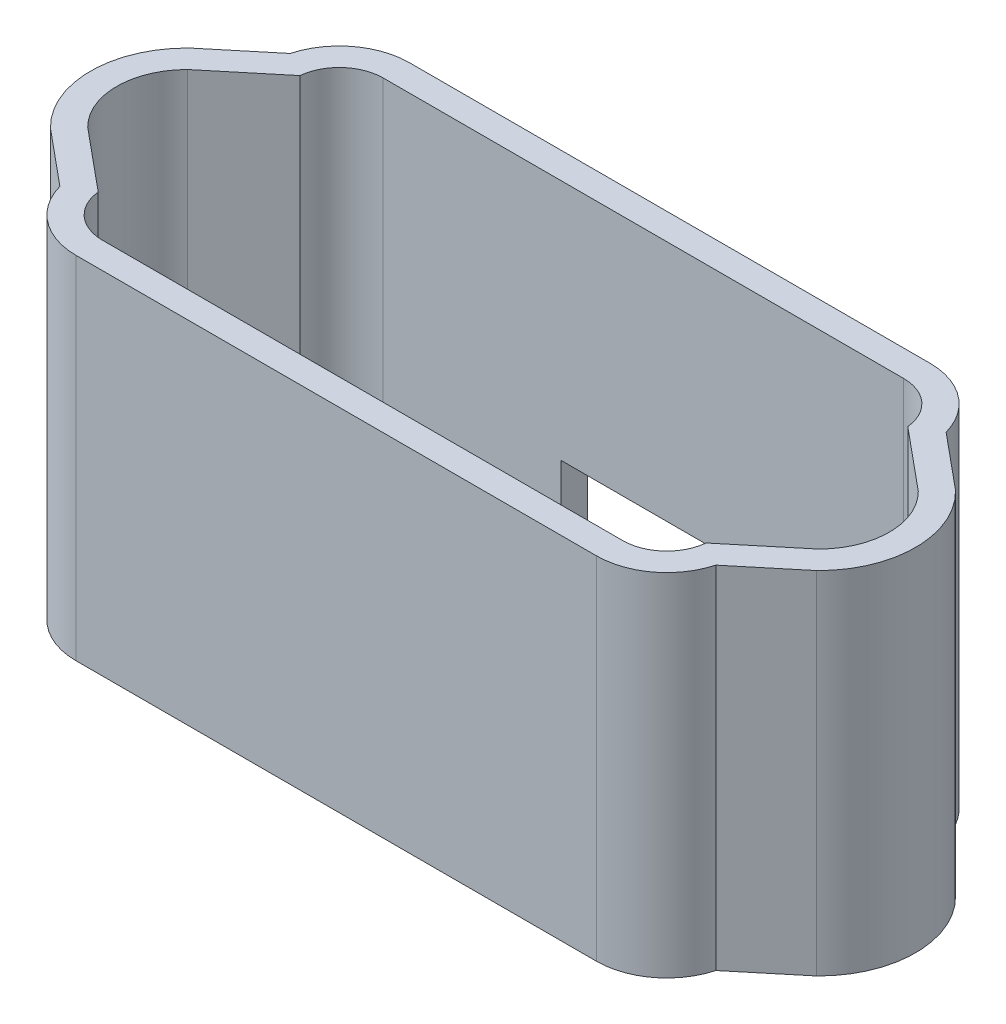
ISO-10303-21;
HEADER;
FILE_DESCRIPTION(('STEP AP214'),'2;1');
FILE_NAME('part.step','',(''),(''),'','','');
FILE_SCHEMA(('AUTOMOTIVE_DESIGN { 1 0 10303 214 1 1 1 1 }'));
ENDSEC;
DATA;
#1=APPLICATION_CONTEXT('core data for automotive mechanical design processes');
#2=APPLICATION_PROTOCOL_DEFINITION('international standard','automotive_design',2000,#1);
#3=PRODUCT_CONTEXT('',#1,'mechanical');
#4=PRODUCT('Part','Part','',(#3));
#5=PRODUCT_RELATED_PRODUCT_CATEGORY('part','',(#4));
#6=PRODUCT_DEFINITION_FORMATION('','',#4);
#7=PRODUCT_DEFINITION_CONTEXT('part definition',#1,'design');
#8=PRODUCT_DEFINITION('design','',#6,#7);
#9=PRODUCT_DEFINITION_SHAPE('','',#8);
#10=(LENGTH_UNIT() NAMED_UNIT(*) SI_UNIT(.MILLI.,.METRE.));
#11=(NAMED_UNIT(*) PLANE_ANGLE_UNIT() SI_UNIT($,.RADIAN.));
#12=(NAMED_UNIT(*) SI_UNIT($,.STERADIAN.) SOLID_ANGLE_UNIT());
#13=UNCERTAINTY_MEASURE_WITH_UNIT(LENGTH_MEASURE(1.E-05),#10,'distance_accuracy_value','');
#14=(GEOMETRIC_REPRESENTATION_CONTEXT(3) GLOBAL_UNCERTAINTY_ASSIGNED_CONTEXT((#13)) GLOBAL_UNIT_ASSIGNED_CONTEXT((#10,
#11,#12)) REPRESENTATION_CONTEXT('',''));
#15=CARTESIAN_POINT('',(0.,0.,0.));
#16=DIRECTION('',(0.,0.,1.));
#17=DIRECTION('',(1.,0.,0.));
#18=AXIS2_PLACEMENT_3D('',#15,#16,#17);
#19=CARTESIAN_POINT('',(-30.7588589412088,20.,-50.3489494411755));
#20=DIRECTION('',(0.,0.,1.));
#21=DIRECTION('',(1.,0.,0.));
#22=AXIS2_PLACEMENT_3D('',#19,#20,#21);
#23=PLANE('',#22);
#24=DIRECTION('',(0.,1.,0.));
#25=VECTOR('',#24,1.);
#26=CARTESIAN_POINT('',(-21.5588589412088,1.,-50.3489494411755));
#27=LINE('',#26,#25);
#28=CARTESIAN_POINT('',(-21.5588589412088,0.,-50.3489494411755));
#29=VERTEX_POINT('',#28);
#30=CARTESIAN_POINT('',(-21.5588589412088,6.2,-50.3489494411755));
#31=VERTEX_POINT('',#30);
#32=EDGE_CURVE('E229',#29,#31,#27,.T.);
#33=ORIENTED_EDGE('',*,*,#32,.T.);
#34=DIRECTION('',(-1.,0.,0.));
#35=VECTOR('',#34,1.);
#36=CARTESIAN_POINT('',(-21.7588589412088,6.2,-50.3489494411755));
#37=LINE('',#36,#35);
#38=CARTESIAN_POINT('',(-30.9588589412088,6.2,-50.3489494411755));
#39=VERTEX_POINT('',#38);
#40=EDGE_CURVE('E227',#31,#39,#37,.T.);
#41=ORIENTED_EDGE('',*,*,#40,.T.);
#42=DIRECTION('',(0.,-1.,0.));
#43=VECTOR('',#42,1.);
#44=CARTESIAN_POINT('',(-30.9588589412088,1.,-50.3489494411755));
#45=LINE('',#44,#43);
#46=CARTESIAN_POINT('',(-30.9588589412088,0.,-50.3489494411755));
#47=VERTEX_POINT('',#46);
#48=EDGE_CURVE('E400',#39,#47,#45,.T.);
#49=ORIENTED_EDGE('',*,*,#48,.T.);
#50=DIRECTION('',(-1.,0.,0.));
#51=VECTOR('',#50,1.);
#52=CARTESIAN_POINT('',(-30.7588589412088,0.,-50.3489494411755));
#53=LINE('',#52,#51);
#54=CARTESIAN_POINT('',(-41.0838589412088,0.,-50.3489494411755));
#55=VERTEX_POINT('',#54);
#56=EDGE_CURVE('E343',#47,#55,#53,.T.);
#57=ORIENTED_EDGE('',*,*,#56,.T.);
#58=DIRECTION('',(0.,-1.,0.));
#59=VECTOR('',#58,1.);
#60=CARTESIAN_POINT('',(-41.0838589412088,20.,-50.3489494411755));
#61=LINE('',#60,#59);
#62=CARTESIAN_POINT('',(-41.0838589412088,20.,-50.3489494411755));
#63=VERTEX_POINT('',#62);
#64=EDGE_CURVE('E243',#63,#55,#61,.T.);
#65=ORIENTED_EDGE('',*,*,#64,.F.);
#66=DIRECTION('',(-1.,0.,0.));
#67=VECTOR('',#66,1.);
#68=CARTESIAN_POINT('',(-11.4338589412088,20.,-50.3489494411755));
#69=LINE('',#68,#67);
#70=CARTESIAN_POINT('',(-11.4338589412088,20.,-50.3489494411755));
#71=VERTEX_POINT('',#70);
#72=EDGE_CURVE('E305',#71,#63,#69,.T.);
#73=ORIENTED_EDGE('',*,*,#72,.F.);
#74=DIRECTION('',(0.,-1.,0.));
#75=VECTOR('',#74,1.);
#76=CARTESIAN_POINT('',(-11.4338589412088,20.,-50.3489494411755));
#77=LINE('',#76,#75);
#78=CARTESIAN_POINT('',(-11.4338589412088,0.,-50.3489494411755));
#79=VERTEX_POINT('',#78);
#80=EDGE_CURVE('E338',#71,#79,#77,.T.);
#81=ORIENTED_EDGE('',*,*,#80,.T.);
#82=EDGE_CURVE('E339',#79,#29,#53,.T.);
#83=ORIENTED_EDGE('',*,*,#82,.T.);
#84=EDGE_LOOP('',(#33,#41,#49,#57,#65,#73,#81,#83));
#85=FACE_BOUND('',#84,.T.);
#86=ADVANCED_FACE('F36',(#85),#23,.F.);
#87=CARTESIAN_POINT('',(-11.4338589412088,20.,-48.8489494411755));
#88=DIRECTION('',(0.,0.,1.));
#89=DIRECTION('',(1.,0.,0.));
#90=AXIS2_PLACEMENT_3D('',#87,#88,#89);
#91=PLANE('',#90);
#92=DIRECTION('',(-1.,0.,0.));
#93=VECTOR('',#92,1.);
#94=CARTESIAN_POINT('',(-21.7588589412088,6.2,-48.8489494411755));
#95=LINE('',#94,#93);
#96=CARTESIAN_POINT('',(-21.5588589412088,6.2,-48.8489494411755));
#97=VERTEX_POINT('',#96);
#98=CARTESIAN_POINT('',(-30.9588589412088,6.2,-48.8489494411755));
#99=VERTEX_POINT('',#98);
#100=EDGE_CURVE('E225',#97,#99,#95,.T.);
#101=ORIENTED_EDGE('',*,*,#100,.F.);
#102=DIRECTION('',(0.,1.,0.));
#103=VECTOR('',#102,1.);
#104=CARTESIAN_POINT('',(-21.5588589412088,1.,-48.8489494411755));
#105=LINE('',#104,#103);
#106=CARTESIAN_POINT('',(-21.5588589412088,1.,-48.8489494411755));
#107=VERTEX_POINT('',#106);
#108=EDGE_CURVE('E212',#107,#97,#105,.T.);
#109=ORIENTED_EDGE('',*,*,#108,.F.);
#110=DIRECTION('',(-1.,0.,0.));
#111=VECTOR('',#110,1.);
#112=CARTESIAN_POINT('',(-11.4338589412088,1.,-48.8489494411755));
#113=LINE('',#112,#111);
#114=CARTESIAN_POINT('',(-11.4338589412088,1.,-48.8489494411755));
#115=VERTEX_POINT('',#114);
#116=EDGE_CURVE('E242',#115,#107,#113,.T.);
#117=ORIENTED_EDGE('',*,*,#116,.F.);
#118=DIRECTION('',(0.,-1.,0.));
#119=VECTOR('',#118,1.);
#120=CARTESIAN_POINT('',(-11.4338589412088,20.,-48.8489494411755));
#121=LINE('',#120,#119);
#122=CARTESIAN_POINT('',(-11.4338589412088,20.,-48.8489494411755));
#123=VERTEX_POINT('',#122);
#124=EDGE_CURVE('E137',#123,#115,#121,.T.);
#125=ORIENTED_EDGE('',*,*,#124,.F.);
#126=DIRECTION('',(-1.,0.,0.));
#127=VECTOR('',#126,1.);
#128=CARTESIAN_POINT('',(-11.4338589412088,20.,-48.8489494411755));
#129=LINE('',#128,#127);
#130=CARTESIAN_POINT('',(-41.0838589412088,20.,-48.8489494411755));
#131=VERTEX_POINT('',#130);
#132=EDGE_CURVE('E294',#123,#131,#129,.T.);
#133=ORIENTED_EDGE('',*,*,#132,.T.);
#134=DIRECTION('',(0.,1.,0.));
#135=VECTOR('',#134,1.);
#136=CARTESIAN_POINT('',(-41.0838589412088,20.,-48.8489494411755));
#137=LINE('',#136,#135);
#138=CARTESIAN_POINT('',(-41.0838589412088,1.,-48.8489494411755));
#139=VERTEX_POINT('',#138);
#140=EDGE_CURVE('E431',#131,#139,#137,.F.);
#141=ORIENTED_EDGE('',*,*,#140,.T.);
#142=DIRECTION('',(-1.,0.,0.));
#143=VECTOR('',#142,1.);
#144=CARTESIAN_POINT('',(-11.4338589412088,1.,-48.8489494411755));
#145=LINE('',#144,#143);
#146=CARTESIAN_POINT('',(-30.9588589412088,1.,-48.8489494411755));
#147=VERTEX_POINT('',#146);
#148=EDGE_CURVE('E240',#147,#139,#145,.T.);
#149=ORIENTED_EDGE('',*,*,#148,.F.);
#150=DIRECTION('',(0.,-1.,0.));
#151=VECTOR('',#150,1.);
#152=CARTESIAN_POINT('',(-30.9588589412088,1.,-48.8489494411755));
#153=LINE('',#152,#151);
#154=EDGE_CURVE('E55',#99,#147,#153,.T.);
#155=ORIENTED_EDGE('',*,*,#154,.F.);
#156=EDGE_LOOP('',(#101,#109,#117,#125,#133,#141,#149,#155));
#157=FACE_BOUND('',#156,.T.);
#158=ADVANCED_FACE('F231',(#157),#91,.T.);
#159=CARTESIAN_POINT('',(-41.0838589412088,0.,-46.3489494411755));
#160=DIRECTION('',(0.,1.,0.));
#161=DIRECTION('',(0.,0.,1.));
#162=AXIS2_PLACEMENT_3D('',#159,#160,#161);
#163=PLANE('',#162);
#164=CARTESIAN_POINT('',(-8.25885894120877,0.,-40.8489494411755));
#165=DIRECTION('',(0.,1.,0.));
#166=DIRECTION('',(0.,0.,1.));
#167=AXIS2_PLACEMENT_3D('',#164,#165,#166);
#168=CIRCLE('',#167,1.375);
#169=CARTESIAN_POINT('',(-8.25885894120877,0.,-39.4739494411755));
#170=VERTEX_POINT('',#169);
#171=EDGE_CURVE('E405',#170,#170,#168,.T.);
#172=ORIENTED_EDGE('',*,*,#171,.T.);
#173=EDGE_LOOP('',(#172));
#174=FACE_BOUND('',#173,.T.);
#175=CARTESIAN_POINT('',(-44.2588589412088,0.,-40.8489494411755));
#176=DIRECTION('',(0.,1.,0.));
#177=DIRECTION('',(0.,0.,1.));
#178=AXIS2_PLACEMENT_3D('',#175,#176,#177);
#179=CIRCLE('',#178,1.375);
#180=CARTESIAN_POINT('',(-44.2588589412088,0.,-39.4739494411755));
#181=VERTEX_POINT('',#180);
#182=EDGE_CURVE('E415',#181,#181,#179,.T.);
#183=ORIENTED_EDGE('',*,*,#182,.T.);
#184=EDGE_LOOP('',(#183));
#185=FACE_BOUND('',#184,.T.);
#186=DIRECTION('',(0.,0.,-1.));
#187=VECTOR('',#186,1.);
#188=CARTESIAN_POINT('',(-21.5588589412088,0.,-37.5322956147835));
#189=LINE('',#188,#187);
#190=CARTESIAN_POINT('',(-21.5588589412088,0.,-48.3489494411755));
#191=VERTEX_POINT('',#190);
#192=EDGE_CURVE('E402',#191,#29,#189,.T.);
#193=ORIENTED_EDGE('',*,*,#192,.T.);
#194=ORIENTED_EDGE('',*,*,#82,.F.);
#195=CARTESIAN_POINT('',(-11.4338589412088,0.,-46.3489494411755));
#196=DIRECTION('',(0.,1.,0.));
#197=DIRECTION('',(0.,0.,1.));
#198=AXIS2_PLACEMENT_3D('',#195,#196,#197);
#199=CIRCLE('',#198,4.);
#200=CARTESIAN_POINT('',(-7.57634192533828,0.,-47.4070432329868));
#201=VERTEX_POINT('',#200);
#202=EDGE_CURVE('E308',#201,#79,#199,.T.);
#203=ORIENTED_EDGE('',*,*,#202,.F.);
#204=DIRECTION('',(-0.769923599158645,0.,-0.638136075973298));
#205=VECTOR('',#204,1.);
#206=CARTESIAN_POINT('',(-4.44391362946542,0.,-44.8107914708893));
#207=LINE('',#206,#205);
#208=CARTESIAN_POINT('',(-4.44391362946542,0.,-44.8107914708893));
#209=VERTEX_POINT('',#208);
#210=EDGE_CURVE('E361',#209,#201,#207,.T.);
#211=ORIENTED_EDGE('',*,*,#210,.F.);
#212=CARTESIAN_POINT('',(-8.25885894120877,0.,-40.8489494411755));
#213=DIRECTION('',(0.,1.,0.));
#214=DIRECTION('',(0.,0.,1.));
#215=AXIS2_PLACEMENT_3D('',#212,#213,#214);
#216=CIRCLE('',#215,5.49999999999999);
#217=CARTESIAN_POINT('',(-4.44391362946543,0.,-36.8871074114616));
#218=VERTEX_POINT('',#217);
#219=EDGE_CURVE('E359',#218,#209,#216,.T.);
#220=ORIENTED_EDGE('',*,*,#219,.F.);
#221=DIRECTION('',(0.769923599158645,0.,-0.638136075973298));
#222=VECTOR('',#221,1.);
#223=CARTESIAN_POINT('',(-7.57634192533828,0.,-34.2908556493642));
#224=LINE('',#223,#222);
#225=CARTESIAN_POINT('',(-7.57634192533828,0.,-34.2908556493642));
#226=VERTEX_POINT('',#225);
#227=EDGE_CURVE('E357',#226,#218,#224,.T.);
#228=ORIENTED_EDGE('',*,*,#227,.F.);
#229=CARTESIAN_POINT('',(-11.4338589412088,0.,-35.3489494411755));
#230=DIRECTION('',(0.,1.,0.));
#231=DIRECTION('',(0.,0.,1.));
#232=AXIS2_PLACEMENT_3D('',#229,#230,#231);
#233=CIRCLE('',#232,4.);
#234=CARTESIAN_POINT('',(-11.4338589412088,0.,-31.3489494411755));
#235=VERTEX_POINT('',#234);
#236=EDGE_CURVE('E355',#235,#226,#233,.T.);
#237=ORIENTED_EDGE('',*,*,#236,.F.);
#238=DIRECTION('',(1.,0.,0.));
#239=VECTOR('',#238,1.);
#240=CARTESIAN_POINT('',(-41.0838589412088,0.,-31.3489494411755));
#241=LINE('',#240,#239);
#242=CARTESIAN_POINT('',(-41.0838589412088,0.,-31.3489494411755));
#243=VERTEX_POINT('',#242);
#244=EDGE_CURVE('E353',#243,#235,#241,.T.);
#245=ORIENTED_EDGE('',*,*,#244,.F.);
#246=CARTESIAN_POINT('',(-41.0838589412088,0.,-35.3489494411755));
#247=DIRECTION('',(0.,1.,0.));
#248=DIRECTION('',(0.,0.,1.));
#249=AXIS2_PLACEMENT_3D('',#246,#247,#248);
#250=CIRCLE('',#249,4.);
#251=CARTESIAN_POINT('',(-44.9413759570793,0.,-34.2908556493642));
#252=VERTEX_POINT('',#251);
#253=EDGE_CURVE('E351',#252,#243,#250,.T.);
#254=ORIENTED_EDGE('',*,*,#253,.F.);
#255=DIRECTION('',(0.769923599158644,0.,0.638136075973299));
#256=VECTOR('',#255,1.);
#257=CARTESIAN_POINT('',(-48.0738042529521,0.,-36.8871074114616));
#258=LINE('',#257,#256);
#259=CARTESIAN_POINT('',(-48.0738042529521,0.,-36.8871074114616));
#260=VERTEX_POINT('',#259);
#261=EDGE_CURVE('E349',#260,#252,#258,.T.);
#262=ORIENTED_EDGE('',*,*,#261,.F.);
#263=CARTESIAN_POINT('',(-44.2588589412088,0.,-40.8489494411755));
#264=DIRECTION('',(0.,1.,0.));
#265=DIRECTION('',(0.,0.,1.));
#266=AXIS2_PLACEMENT_3D('',#263,#264,#265);
#267=CIRCLE('',#266,5.49999999999998);
#268=CARTESIAN_POINT('',(-48.0738042529521,0.,-44.8107914708893));
#269=VERTEX_POINT('',#268);
#270=EDGE_CURVE('E347',#269,#260,#267,.T.);
#271=ORIENTED_EDGE('',*,*,#270,.F.);
#272=DIRECTION('',(-0.769923599158645,0.,0.638136075973298));
#273=VECTOR('',#272,1.);
#274=CARTESIAN_POINT('',(-44.9413759570793,0.,-47.4070432329868));
#275=LINE('',#274,#273);
#276=CARTESIAN_POINT('',(-44.9413759570793,0.,-47.4070432329868));
#277=VERTEX_POINT('',#276);
#278=EDGE_CURVE('E345',#277,#269,#275,.T.);
#279=ORIENTED_EDGE('',*,*,#278,.F.);
#280=CARTESIAN_POINT('',(-41.0838589412088,0.,-46.3489494411755));
#281=DIRECTION('',(0.,1.,0.));
#282=DIRECTION('',(0.,0.,1.));
#283=AXIS2_PLACEMENT_3D('',#280,#281,#282);
#284=CIRCLE('',#283,4.);
#285=EDGE_CURVE('E342',#55,#277,#284,.T.);
#286=ORIENTED_EDGE('',*,*,#285,.F.);
#287=ORIENTED_EDGE('',*,*,#56,.F.);
#288=DIRECTION('',(0.,0.,-1.));
#289=VECTOR('',#288,1.);
#290=CARTESIAN_POINT('',(-30.9588589412088,0.,-46.3489494411755));
#291=LINE('',#290,#289);
#292=CARTESIAN_POINT('',(-30.9588589412088,0.,-48.3489494411755));
#293=VERTEX_POINT('',#292);
#294=EDGE_CURVE('E410',#293,#47,#291,.T.);
#295=ORIENTED_EDGE('',*,*,#294,.F.);
#296=DIRECTION('',(1.,0.,0.));
#297=VECTOR('',#296,1.);
#298=CARTESIAN_POINT('',(-30.7588589412088,0.,-48.3489494411755));
#299=LINE('',#298,#297);
#300=EDGE_CURVE('E220',#293,#191,#299,.T.);
#301=ORIENTED_EDGE('',*,*,#300,.T.);
#302=EDGE_LOOP('',(#193,#194,#203,#211,#220,#228,#237,#245,#254,#262,#271,#279,#286,#287,#295,#301));
#303=FACE_BOUND('',#302,.T.);
#304=ADVANCED_FACE('F486',(#174,#185,#303),#163,.F.);
#305=CARTESIAN_POINT('',(-41.0838589412088,1.,-46.3489494411755));
#306=DIRECTION('',(0.,1.,0.));
#307=DIRECTION('',(0.,0.,1.));
#308=AXIS2_PLACEMENT_3D('',#305,#306,#307);
#309=PLANE('',#308);
#310=CARTESIAN_POINT('',(-8.25885894120877,1.,-40.8489494411755));
#311=DIRECTION('',(0.,1.,0.));
#312=DIRECTION('',(0.,0.,1.));
#313=AXIS2_PLACEMENT_3D('',#310,#311,#312);
#314=CIRCLE('',#313,1.375);
#315=CARTESIAN_POINT('',(-8.25885894120877,1.,-39.4739494411755));
#316=VERTEX_POINT('',#315);
#317=EDGE_CURVE('E412',#316,#316,#314,.T.);
#318=ORIENTED_EDGE('',*,*,#317,.F.);
#319=EDGE_LOOP('',(#318));
#320=FACE_BOUND('',#319,.T.);
#321=CARTESIAN_POINT('',(-44.2588589412088,1.,-40.8489494411755));
#322=DIRECTION('',(0.,1.,0.));
#323=DIRECTION('',(0.,0.,1.));
#324=AXIS2_PLACEMENT_3D('',#321,#322,#323);
#325=CIRCLE('',#324,1.375);
#326=CARTESIAN_POINT('',(-44.2588589412088,1.,-39.4739494411755));
#327=VERTEX_POINT('',#326);
#328=EDGE_CURVE('E416',#327,#327,#325,.T.);
#329=ORIENTED_EDGE('',*,*,#328,.F.);
#330=EDGE_LOOP('',(#329));
#331=FACE_BOUND('',#330,.T.);
#332=ORIENTED_EDGE('',*,*,#116,.T.);
#333=DIRECTION('',(0.,0.,-1.));
#334=VECTOR('',#333,1.);
#335=CARTESIAN_POINT('',(-21.5588589412088,1.,-37.5322956147835));
#336=LINE('',#335,#334);
#337=CARTESIAN_POINT('',(-21.5588589412088,1.,-48.3489494411755));
#338=VERTEX_POINT('',#337);
#339=EDGE_CURVE('E46',#338,#107,#336,.T.);
#340=ORIENTED_EDGE('',*,*,#339,.F.);
#341=DIRECTION('',(1.,0.,0.));
#342=VECTOR('',#341,1.);
#343=CARTESIAN_POINT('',(-41.0838589412088,1.,-48.3489494411755));
#344=LINE('',#343,#342);
#345=CARTESIAN_POINT('',(-30.9588589412088,1.,-48.3489494411755));
#346=VERTEX_POINT('',#345);
#347=EDGE_CURVE('E239',#346,#338,#344,.T.);
#348=ORIENTED_EDGE('',*,*,#347,.F.);
#349=DIRECTION('',(0.,0.,-1.));
#350=VECTOR('',#349,1.);
#351=CARTESIAN_POINT('',(-30.9588589412088,1.,-46.3489494411755));
#352=LINE('',#351,#350);
#353=EDGE_CURVE('E12',#346,#147,#352,.T.);
#354=ORIENTED_EDGE('',*,*,#353,.T.);
#355=ORIENTED_EDGE('',*,*,#148,.T.);
#356=CARTESIAN_POINT('',(-41.0838589412088,1.,-46.3489494411755));
#357=DIRECTION('',(0.,1.,0.));
#358=DIRECTION('',(0.,0.,1.));
#359=AXIS2_PLACEMENT_3D('',#356,#357,#358);
#360=CIRCLE('',#359,2.5);
#361=CARTESIAN_POINT('',(-43.5718277650405,1.,-46.5939211367682));
#362=VERTEX_POINT('',#361);
#363=EDGE_CURVE('E244',#139,#362,#360,.T.);
#364=ORIENTED_EDGE('',*,*,#363,.T.);
#365=DIRECTION('',(-0.769923599158645,0.,0.638136075973298));
#366=VECTOR('',#365,1.);
#367=CARTESIAN_POINT('',(-43.4029269791954,1.,-46.7339112407548));
#368=LINE('',#367,#366);
#369=CARTESIAN_POINT('',(-47.0701756153335,1.,-43.6943841281414));
#370=VERTEX_POINT('',#369);
#371=EDGE_CURVE('E247',#362,#370,#368,.T.);
#372=ORIENTED_EDGE('',*,*,#371,.T.);
#373=CARTESIAN_POINT('',(-44.2588589412088,1.,-40.8489494411755));
#374=DIRECTION('',(0.,1.,0.));
#375=DIRECTION('',(0.,0.,1.));
#376=AXIS2_PLACEMENT_3D('',#373,#374,#375);
#377=CIRCLE('',#376,3.99999999999998);
#378=CARTESIAN_POINT('',(-47.0701756153335,1.,-38.0035147542095));
#379=VERTEX_POINT('',#378);
#380=EDGE_CURVE('E250',#370,#379,#377,.T.);
#381=ORIENTED_EDGE('',*,*,#380,.T.);
#382=DIRECTION('',(0.769923599158644,0.,0.638136075973299));
#383=VECTOR('',#382,1.);
#384=CARTESIAN_POINT('',(-47.0528007133483,1.,-37.9891139074432));
#385=LINE('',#384,#383);
#386=CARTESIAN_POINT('',(-43.5718277650405,1.,-35.1039777455827));
#387=VERTEX_POINT('',#386);
#388=EDGE_CURVE('E253',#379,#387,#385,.T.);
#389=ORIENTED_EDGE('',*,*,#388,.T.);
#390=CARTESIAN_POINT('',(-41.0838589412088,1.,-35.3489494411755));
#391=DIRECTION('',(0.,1.,0.));
#392=DIRECTION('',(0.,0.,1.));
#393=AXIS2_PLACEMENT_3D('',#390,#391,#392);
#394=CIRCLE('',#393,2.5);
#395=CARTESIAN_POINT('',(-41.0838589412088,1.,-32.8489494411755));
#396=VERTEX_POINT('',#395);
#397=EDGE_CURVE('E256',#387,#396,#394,.T.);
#398=ORIENTED_EDGE('',*,*,#397,.T.);
#399=DIRECTION('',(1.,0.,0.));
#400=VECTOR('',#399,1.);
#401=CARTESIAN_POINT('',(-41.0838589412088,1.,-32.8489494411755));
#402=LINE('',#401,#400);
#403=CARTESIAN_POINT('',(-11.4338589412088,1.,-32.8489494411755));
#404=VERTEX_POINT('',#403);
#405=EDGE_CURVE('E259',#396,#404,#402,.T.);
#406=ORIENTED_EDGE('',*,*,#405,.T.);
#407=CARTESIAN_POINT('',(-11.4338589412088,1.,-35.3489494411755));
#408=DIRECTION('',(0.,1.,0.));
#409=DIRECTION('',(0.,0.,1.));
#410=AXIS2_PLACEMENT_3D('',#407,#408,#409);
#411=CIRCLE('',#410,2.5);
#412=CARTESIAN_POINT('',(-8.94589011737709,1.,-35.1039777455827));
#413=VERTEX_POINT('',#412);
#414=EDGE_CURVE('E262',#404,#413,#411,.T.);
#415=ORIENTED_EDGE('',*,*,#414,.T.);
#416=DIRECTION('',(0.769923599158645,0.,-0.638136075973298));
#417=VECTOR('',#416,1.);
#418=CARTESIAN_POINT('',(-9.11479090322213,1.,-34.9639876415961));
#419=LINE('',#418,#417);
#420=CARTESIAN_POINT('',(-5.44754226708406,1.,-38.0035147542095));
#421=VERTEX_POINT('',#420);
#422=EDGE_CURVE('E265',#413,#421,#419,.T.);
#423=ORIENTED_EDGE('',*,*,#422,.T.);
#424=CARTESIAN_POINT('',(-8.25885894120877,1.,-40.8489494411755));
#425=DIRECTION('',(0.,1.,0.));
#426=DIRECTION('',(0.,0.,1.));
#427=AXIS2_PLACEMENT_3D('',#424,#425,#426);
#428=CIRCLE('',#427,3.99999999999999);
#429=CARTESIAN_POINT('',(-5.44754226708406,1.,-43.6943841281414));
#430=VERTEX_POINT('',#429);
#431=EDGE_CURVE('E268',#421,#430,#428,.T.);
#432=ORIENTED_EDGE('',*,*,#431,.T.);
#433=DIRECTION('',(-0.769923599158645,0.,-0.638136075973298));
#434=VECTOR('',#433,1.);
#435=CARTESIAN_POINT('',(-5.46491716906923,1.,-43.7087849749077));
#436=LINE('',#435,#434);
#437=CARTESIAN_POINT('',(-8.94589011737709,1.,-46.5939211367682));
#438=VERTEX_POINT('',#437);
#439=EDGE_CURVE('E271',#430,#438,#436,.T.);
#440=ORIENTED_EDGE('',*,*,#439,.T.);
#441=CARTESIAN_POINT('',(-11.4338589412088,1.,-46.3489494411755));
#442=DIRECTION('',(0.,1.,0.));
#443=DIRECTION('',(0.,0.,1.));
#444=AXIS2_PLACEMENT_3D('',#441,#442,#443);
#445=CIRCLE('',#444,2.5);
#446=EDGE_CURVE('E272',#438,#115,#445,.T.);
#447=ORIENTED_EDGE('',*,*,#446,.T.);
#448=EDGE_LOOP('',(#332,#340,#348,#354,#355,#364,#372,#381,#389,#398,#406,#415,#423,#432,#440,#447));
#449=FACE_BOUND('',#448,.T.);
#450=ADVANCED_FACE('F460',(#320,#331,#449),#309,.T.);
#451=CARTESIAN_POINT('',(-41.0838589412088,20.,-46.3489494411755));
#452=DIRECTION('',(0.,1.,0.));
#453=DIRECTION('',(0.,0.,1.));
#454=AXIS2_PLACEMENT_3D('',#451,#452,#453);
#455=PLANE('',#454);
#456=ORIENTED_EDGE('',*,*,#72,.T.);
#457=CARTESIAN_POINT('',(-41.0838589412088,20.,-46.3489494411755));
#458=DIRECTION('',(0.,1.,0.));
#459=DIRECTION('',(0.,0.,1.));
#460=AXIS2_PLACEMENT_3D('',#457,#458,#459);
#461=CIRCLE('',#460,4.);
#462=CARTESIAN_POINT('',(-44.9413759570793,20.,-47.4070432329868));
#463=VERTEX_POINT('',#462);
#464=EDGE_CURVE('E307',#63,#463,#461,.T.);
#465=ORIENTED_EDGE('',*,*,#464,.T.);
#466=DIRECTION('',(-0.769923599158645,0.,0.638136075973298));
#467=VECTOR('',#466,1.);
#468=CARTESIAN_POINT('',(-44.9413759570793,20.,-47.4070432329868));
#469=LINE('',#468,#467);
#470=CARTESIAN_POINT('',(-48.0738042529521,20.,-44.8107914708893));
#471=VERTEX_POINT('',#470);
#472=EDGE_CURVE('E311',#463,#471,#469,.T.);
#473=ORIENTED_EDGE('',*,*,#472,.T.);
#474=CARTESIAN_POINT('',(-44.2588589412088,20.,-40.8489494411755));
#475=DIRECTION('',(0.,1.,0.));
#476=DIRECTION('',(0.,0.,1.));
#477=AXIS2_PLACEMENT_3D('',#474,#475,#476);
#478=CIRCLE('',#477,5.49999999999998);
#479=CARTESIAN_POINT('',(-48.0738042529521,20.,-36.8871074114616));
#480=VERTEX_POINT('',#479);
#481=EDGE_CURVE('E314',#471,#480,#478,.T.);
#482=ORIENTED_EDGE('',*,*,#481,.T.);
#483=DIRECTION('',(0.769923599158644,0.,0.638136075973299));
#484=VECTOR('',#483,1.);
#485=CARTESIAN_POINT('',(-48.0738042529521,20.,-36.8871074114616));
#486=LINE('',#485,#484);
#487=CARTESIAN_POINT('',(-44.9413759570793,20.,-34.2908556493642));
#488=VERTEX_POINT('',#487);
#489=EDGE_CURVE('E317',#480,#488,#486,.T.);
#490=ORIENTED_EDGE('',*,*,#489,.T.);
#491=CARTESIAN_POINT('',(-41.0838589412088,20.,-35.3489494411755));
#492=DIRECTION('',(0.,1.,0.));
#493=DIRECTION('',(0.,0.,1.));
#494=AXIS2_PLACEMENT_3D('',#491,#492,#493);
#495=CIRCLE('',#494,4.);
#496=CARTESIAN_POINT('',(-41.0838589412088,20.,-31.3489494411755));
#497=VERTEX_POINT('',#496);
#498=EDGE_CURVE('E320',#488,#497,#495,.T.);
#499=ORIENTED_EDGE('',*,*,#498,.T.);
#500=DIRECTION('',(1.,0.,0.));
#501=VECTOR('',#500,1.);
#502=CARTESIAN_POINT('',(-41.0838589412088,20.,-31.3489494411755));
#503=LINE('',#502,#501);
#504=CARTESIAN_POINT('',(-11.4338589412088,20.,-31.3489494411755));
#505=VERTEX_POINT('',#504);
#506=EDGE_CURVE('E323',#497,#505,#503,.T.);
#507=ORIENTED_EDGE('',*,*,#506,.T.);
#508=CARTESIAN_POINT('',(-11.4338589412088,20.,-35.3489494411755));
#509=DIRECTION('',(0.,1.,0.));
#510=DIRECTION('',(0.,0.,1.));
#511=AXIS2_PLACEMENT_3D('',#508,#509,#510);
#512=CIRCLE('',#511,4.);
#513=CARTESIAN_POINT('',(-7.57634192533828,20.,-34.2908556493642));
#514=VERTEX_POINT('',#513);
#515=EDGE_CURVE('E326',#505,#514,#512,.T.);
#516=ORIENTED_EDGE('',*,*,#515,.T.);
#517=DIRECTION('',(0.769923599158645,0.,-0.638136075973298));
#518=VECTOR('',#517,1.);
#519=CARTESIAN_POINT('',(-7.57634192533828,20.,-34.2908556493642));
#520=LINE('',#519,#518);
#521=CARTESIAN_POINT('',(-4.44391362946543,20.,-36.8871074114616));
#522=VERTEX_POINT('',#521);
#523=EDGE_CURVE('E329',#514,#522,#520,.T.);
#524=ORIENTED_EDGE('',*,*,#523,.T.);
#525=CARTESIAN_POINT('',(-8.25885894120877,20.,-40.8489494411755));
#526=DIRECTION('',(0.,1.,0.));
#527=DIRECTION('',(0.,0.,1.));
#528=AXIS2_PLACEMENT_3D('',#525,#526,#527);
#529=CIRCLE('',#528,5.49999999999999);
#530=CARTESIAN_POINT('',(-4.44391362946542,20.,-44.8107914708893));
#531=VERTEX_POINT('',#530);
#532=EDGE_CURVE('E332',#522,#531,#529,.T.);
#533=ORIENTED_EDGE('',*,*,#532,.T.);
#534=DIRECTION('',(-0.769923599158645,0.,-0.638136075973298));
#535=VECTOR('',#534,1.);
#536=CARTESIAN_POINT('',(-4.44391362946542,20.,-44.8107914708893));
#537=LINE('',#536,#535);
#538=CARTESIAN_POINT('',(-7.57634192533828,20.,-47.4070432329868));
#539=VERTEX_POINT('',#538);
#540=EDGE_CURVE('E335',#531,#539,#537,.T.);
#541=ORIENTED_EDGE('',*,*,#540,.T.);
#542=CARTESIAN_POINT('',(-11.4338589412088,20.,-46.3489494411755));
#543=DIRECTION('',(0.,1.,0.));
#544=DIRECTION('',(0.,0.,1.));
#545=AXIS2_PLACEMENT_3D('',#542,#543,#544);
#546=CIRCLE('',#545,4.);
#547=EDGE_CURVE('E147',#539,#71,#546,.T.);
#548=ORIENTED_EDGE('',*,*,#547,.T.);
#549=EDGE_LOOP('',(#456,#465,#473,#482,#490,#499,#507,#516,#524,#533,#541,#548));
#550=FACE_BOUND('',#549,.T.);
#551=DIRECTION('',(-0.769923599158645,0.,0.638136075973298));
#552=VECTOR('',#551,1.);
#553=CARTESIAN_POINT('',(-43.4029269791954,20.,-46.7339112407548));
#554=LINE('',#553,#552);
#555=CARTESIAN_POINT('',(-43.5718277650405,20.,-46.5939211367682));
#556=VERTEX_POINT('',#555);
#557=CARTESIAN_POINT('',(-47.0701756153335,20.,-43.6943841281414));
#558=VERTEX_POINT('',#557);
#559=EDGE_CURVE('E291',#556,#558,#554,.T.);
#560=ORIENTED_EDGE('',*,*,#559,.F.);
#561=CARTESIAN_POINT('',(-41.0838589412088,20.,-46.3489494411755));
#562=DIRECTION('',(0.,1.,0.));
#563=DIRECTION('',(0.,0.,1.));
#564=AXIS2_PLACEMENT_3D('',#561,#562,#563);
#565=CIRCLE('',#564,2.5);
#566=EDGE_CURVE('E293',#131,#556,#565,.T.);
#567=ORIENTED_EDGE('',*,*,#566,.F.);
#568=ORIENTED_EDGE('',*,*,#132,.F.);
#569=CARTESIAN_POINT('',(-11.4338589412088,20.,-46.3489494411755));
#570=DIRECTION('',(0.,1.,0.));
#571=DIRECTION('',(0.,0.,1.));
#572=AXIS2_PLACEMENT_3D('',#569,#570,#571);
#573=CIRCLE('',#572,2.5);
#574=CARTESIAN_POINT('',(-8.94589011737709,20.,-46.5939211367682));
#575=VERTEX_POINT('',#574);
#576=EDGE_CURVE('E40',#575,#123,#573,.T.);
#577=ORIENTED_EDGE('',*,*,#576,.F.);
#578=DIRECTION('',(-0.769923599158645,0.,-0.638136075973298));
#579=VECTOR('',#578,1.);
#580=CARTESIAN_POINT('',(-5.46491716906923,20.,-43.7087849749077));
#581=LINE('',#580,#579);
#582=CARTESIAN_POINT('',(-5.44754226708406,20.,-43.6943841281414));
#583=VERTEX_POINT('',#582);
#584=EDGE_CURVE('E274',#583,#575,#581,.T.);
#585=ORIENTED_EDGE('',*,*,#584,.F.);
#586=CARTESIAN_POINT('',(-8.25885894120877,20.,-40.8489494411755));
#587=DIRECTION('',(0.,1.,0.));
#588=DIRECTION('',(0.,0.,1.));
#589=AXIS2_PLACEMENT_3D('',#586,#587,#588);
#590=CIRCLE('',#589,3.99999999999999);
#591=CARTESIAN_POINT('',(-5.44754226708406,20.,-38.0035147542095));
#592=VERTEX_POINT('',#591);
#593=EDGE_CURVE('E277',#592,#583,#590,.T.);
#594=ORIENTED_EDGE('',*,*,#593,.F.);
#595=DIRECTION('',(0.769923599158645,0.,-0.638136075973298));
#596=VECTOR('',#595,1.);
#597=CARTESIAN_POINT('',(-9.11479090322213,20.,-34.9639876415961));
#598=LINE('',#597,#596);
#599=CARTESIAN_POINT('',(-8.94589011737709,20.,-35.1039777455827));
#600=VERTEX_POINT('',#599);
#601=EDGE_CURVE('E279',#600,#592,#598,.T.);
#602=ORIENTED_EDGE('',*,*,#601,.F.);
#603=CARTESIAN_POINT('',(-11.4338589412088,20.,-35.3489494411755));
#604=DIRECTION('',(0.,1.,0.));
#605=DIRECTION('',(0.,0.,1.));
#606=AXIS2_PLACEMENT_3D('',#603,#604,#605);
#607=CIRCLE('',#606,2.5);
#608=CARTESIAN_POINT('',(-11.4338589412088,20.,-32.8489494411755));
#609=VERTEX_POINT('',#608);
#610=EDGE_CURVE('E281',#609,#600,#607,.T.);
#611=ORIENTED_EDGE('',*,*,#610,.F.);
#612=DIRECTION('',(1.,0.,0.));
#613=VECTOR('',#612,1.);
#614=CARTESIAN_POINT('',(-41.0838589412088,20.,-32.8489494411755));
#615=LINE('',#614,#613);
#616=CARTESIAN_POINT('',(-41.0838589412088,20.,-32.8489494411755));
#617=VERTEX_POINT('',#616);
#618=EDGE_CURVE('E283',#617,#609,#615,.T.);
#619=ORIENTED_EDGE('',*,*,#618,.F.);
#620=CARTESIAN_POINT('',(-41.0838589412088,20.,-35.3489494411755));
#621=DIRECTION('',(0.,1.,0.));
#622=DIRECTION('',(0.,0.,1.));
#623=AXIS2_PLACEMENT_3D('',#620,#621,#622);
#624=CIRCLE('',#623,2.5);
#625=CARTESIAN_POINT('',(-43.5718277650405,20.,-35.1039777455827));
#626=VERTEX_POINT('',#625);
#627=EDGE_CURVE('E285',#626,#617,#624,.T.);
#628=ORIENTED_EDGE('',*,*,#627,.F.);
#629=DIRECTION('',(0.769923599158644,0.,0.638136075973299));
#630=VECTOR('',#629,1.);
#631=CARTESIAN_POINT('',(-47.0528007133483,20.,-37.9891139074432));
#632=LINE('',#631,#630);
#633=CARTESIAN_POINT('',(-47.0701756153335,20.,-38.0035147542095));
#634=VERTEX_POINT('',#633);
#635=EDGE_CURVE('E287',#634,#626,#632,.T.);
#636=ORIENTED_EDGE('',*,*,#635,.F.);
#637=CARTESIAN_POINT('',(-44.2588589412088,20.,-40.8489494411755));
#638=DIRECTION('',(0.,1.,0.));
#639=DIRECTION('',(0.,0.,1.));
#640=AXIS2_PLACEMENT_3D('',#637,#638,#639);
#641=CIRCLE('',#640,3.99999999999998);
#642=EDGE_CURVE('E289',#558,#634,#641,.T.);
#643=ORIENTED_EDGE('',*,*,#642,.F.);
#644=EDGE_LOOP('',(#560,#567,#568,#577,#585,#594,#602,#611,#619,#628,#636,#643));
#645=FACE_BOUND('',#644,.T.);
#646=ADVANCED_FACE('F469',(#550,#645),#455,.T.);
#647=CARTESIAN_POINT('',(-41.0838589412088,20.,-46.3489494411755));
#648=DIRECTION('',(0.,-1.,0.));
#649=DIRECTION('',(0.,0.,-1.));
#650=AXIS2_PLACEMENT_3D('',#647,#648,#649);
#651=CYLINDRICAL_SURFACE('',#650,4.);
#652=ORIENTED_EDGE('',*,*,#285,.T.);
#653=DIRECTION('',(0.,-1.,0.));
#654=VECTOR('',#653,1.);
#655=CARTESIAN_POINT('',(-44.9413759570793,20.,-47.4070432329868));
#656=LINE('',#655,#654);
#657=EDGE_CURVE('E394',#463,#277,#656,.T.);
#658=ORIENTED_EDGE('',*,*,#657,.F.);
#659=ORIENTED_EDGE('',*,*,#464,.F.);
#660=ORIENTED_EDGE('',*,*,#64,.T.);
#661=EDGE_LOOP('',(#652,#658,#659,#660));
#662=FACE_BOUND('',#661,.T.);
#663=ADVANCED_FACE('F560',(#662),#651,.T.);
#664=CARTESIAN_POINT('',(-44.9413759570793,20.,-47.4070432329868));
#665=DIRECTION('',(0.638136075973298,0.,0.769923599158645));
#666=DIRECTION('',(0.769923599158645,0.,-0.638136075973298));
#667=AXIS2_PLACEMENT_3D('',#664,#665,#666);
#668=PLANE('',#667);
#669=ORIENTED_EDGE('',*,*,#278,.T.);
#670=DIRECTION('',(0.,-1.,0.));
#671=VECTOR('',#670,1.);
#672=CARTESIAN_POINT('',(-48.0738042529521,20.,-44.8107914708893));
#673=LINE('',#672,#671);
#674=EDGE_CURVE('E391',#471,#269,#673,.T.);
#675=ORIENTED_EDGE('',*,*,#674,.F.);
#676=ORIENTED_EDGE('',*,*,#472,.F.);
#677=ORIENTED_EDGE('',*,*,#657,.T.);
#678=EDGE_LOOP('',(#669,#675,#676,#677));
#679=FACE_BOUND('',#678,.T.);
#680=ADVANCED_FACE('F557',(#679),#668,.F.);
#681=CARTESIAN_POINT('',(-44.2588589412088,20.,-40.8489494411755));
#682=DIRECTION('',(0.,-1.,0.));
#683=DIRECTION('',(0.,0.,-1.));
#684=AXIS2_PLACEMENT_3D('',#681,#682,#683);
#685=CYLINDRICAL_SURFACE('',#684,5.49999999999998);
#686=ORIENTED_EDGE('',*,*,#270,.T.);
#687=DIRECTION('',(0.,-1.,0.));
#688=VECTOR('',#687,1.);
#689=CARTESIAN_POINT('',(-48.0738042529521,20.,-36.8871074114616));
#690=LINE('',#689,#688);
#691=EDGE_CURVE('E388',#480,#260,#690,.T.);
#692=ORIENTED_EDGE('',*,*,#691,.F.);
#693=ORIENTED_EDGE('',*,*,#481,.F.);
#694=ORIENTED_EDGE('',*,*,#674,.T.);
#695=EDGE_LOOP('',(#686,#692,#693,#694));
#696=FACE_BOUND('',#695,.T.);
#697=ADVANCED_FACE('F553',(#696),#685,.T.);
#698=CARTESIAN_POINT('',(-48.0738042529521,20.,-36.8871074114616));
#699=DIRECTION('',(0.638136075973299,0.,-0.769923599158644));
#700=DIRECTION('',(-0.769923599158644,0.,-0.638136075973299));
#701=AXIS2_PLACEMENT_3D('',#698,#699,#700);
#702=PLANE('',#701);
#703=ORIENTED_EDGE('',*,*,#261,.T.);
#704=DIRECTION('',(0.,-1.,0.));
#705=VECTOR('',#704,1.);
#706=CARTESIAN_POINT('',(-44.9413759570793,20.,-34.2908556493642));
#707=LINE('',#706,#705);
#708=EDGE_CURVE('E385',#488,#252,#707,.T.);
#709=ORIENTED_EDGE('',*,*,#708,.F.);
#710=ORIENTED_EDGE('',*,*,#489,.F.);
#711=ORIENTED_EDGE('',*,*,#691,.T.);
#712=EDGE_LOOP('',(#703,#709,#710,#711));
#713=FACE_BOUND('',#712,.T.);
#714=ADVANCED_FACE('F549',(#713),#702,.F.);
#715=CARTESIAN_POINT('',(-41.0838589412088,20.,-35.3489494411755));
#716=DIRECTION('',(0.,-1.,0.));
#717=DIRECTION('',(0.,0.,-1.));
#718=AXIS2_PLACEMENT_3D('',#715,#716,#717);
#719=CYLINDRICAL_SURFACE('',#718,4.);
#720=ORIENTED_EDGE('',*,*,#253,.T.);
#721=DIRECTION('',(0.,-1.,0.));
#722=VECTOR('',#721,1.);
#723=CARTESIAN_POINT('',(-41.0838589412088,20.,-31.3489494411755));
#724=LINE('',#723,#722);
#725=EDGE_CURVE('E382',#497,#243,#724,.T.);
#726=ORIENTED_EDGE('',*,*,#725,.F.);
#727=ORIENTED_EDGE('',*,*,#498,.F.);
#728=ORIENTED_EDGE('',*,*,#708,.T.);
#729=EDGE_LOOP('',(#720,#726,#727,#728));
#730=FACE_BOUND('',#729,.T.);
#731=ADVANCED_FACE('F544',(#730),#719,.T.);
#732=CARTESIAN_POINT('',(-41.0838589412088,20.,-31.3489494411755));
#733=DIRECTION('',(0.,0.,-1.));
#734=DIRECTION('',(-1.,0.,0.));
#735=AXIS2_PLACEMENT_3D('',#732,#733,#734);
#736=PLANE('',#735);
#737=ORIENTED_EDGE('',*,*,#244,.T.);
#738=DIRECTION('',(0.,-1.,0.));
#739=VECTOR('',#738,1.);
#740=CARTESIAN_POINT('',(-11.4338589412088,20.,-31.3489494411755));
#741=LINE('',#740,#739);
#742=EDGE_CURVE('E379',#505,#235,#741,.T.);
#743=ORIENTED_EDGE('',*,*,#742,.F.);
#744=ORIENTED_EDGE('',*,*,#506,.F.);
#745=ORIENTED_EDGE('',*,*,#725,.T.);
#746=EDGE_LOOP('',(#737,#743,#744,#745));
#747=FACE_BOUND('',#746,.T.);
#748=ADVANCED_FACE('F538',(#747),#736,.F.);
#749=CARTESIAN_POINT('',(-11.4338589412088,20.,-35.3489494411755));
#750=DIRECTION('',(0.,-1.,0.));
#751=DIRECTION('',(0.,0.,-1.));
#752=AXIS2_PLACEMENT_3D('',#749,#750,#751);
#753=CYLINDRICAL_SURFACE('',#752,4.);
#754=ORIENTED_EDGE('',*,*,#236,.T.);
#755=DIRECTION('',(0.,-1.,0.));
#756=VECTOR('',#755,1.);
#757=CARTESIAN_POINT('',(-7.57634192533828,20.,-34.2908556493642));
#758=LINE('',#757,#756);
#759=EDGE_CURVE('E376',#514,#226,#758,.T.);
#760=ORIENTED_EDGE('',*,*,#759,.F.);
#761=ORIENTED_EDGE('',*,*,#515,.F.);
#762=ORIENTED_EDGE('',*,*,#742,.T.);
#763=EDGE_LOOP('',(#754,#760,#761,#762));
#764=FACE_BOUND('',#763,.T.);
#765=ADVANCED_FACE('F534',(#764),#753,.T.);
#766=CARTESIAN_POINT('',(-7.57634192533828,20.,-34.2908556493642));
#767=DIRECTION('',(-0.638136075973298,0.,-0.769923599158645));
#768=DIRECTION('',(-0.769923599158645,0.,0.638136075973298));
#769=AXIS2_PLACEMENT_3D('',#766,#767,#768);
#770=PLANE('',#769);
#771=ORIENTED_EDGE('',*,*,#227,.T.);
#772=DIRECTION('',(0.,-1.,0.));
#773=VECTOR('',#772,1.);
#774=CARTESIAN_POINT('',(-4.44391362946543,20.,-36.8871074114616));
#775=LINE('',#774,#773);
#776=EDGE_CURVE('E373',#522,#218,#775,.T.);
#777=ORIENTED_EDGE('',*,*,#776,.F.);
#778=ORIENTED_EDGE('',*,*,#523,.F.);
#779=ORIENTED_EDGE('',*,*,#759,.T.);
#780=EDGE_LOOP('',(#771,#777,#778,#779));
#781=FACE_BOUND('',#780,.T.);
#782=ADVANCED_FACE('F530',(#781),#770,.F.);
#783=CARTESIAN_POINT('',(-8.25885894120877,20.,-40.8489494411755));
#784=DIRECTION('',(0.,-1.,0.));
#785=DIRECTION('',(0.,0.,-1.));
#786=AXIS2_PLACEMENT_3D('',#783,#784,#785);
#787=CYLINDRICAL_SURFACE('',#786,5.49999999999999);
#788=ORIENTED_EDGE('',*,*,#219,.T.);
#789=DIRECTION('',(0.,-1.,0.));
#790=VECTOR('',#789,1.);
#791=CARTESIAN_POINT('',(-4.44391362946542,20.,-44.8107914708893));
#792=LINE('',#791,#790);
#793=EDGE_CURVE('E370',#531,#209,#792,.T.);
#794=ORIENTED_EDGE('',*,*,#793,.F.);
#795=ORIENTED_EDGE('',*,*,#532,.F.);
#796=ORIENTED_EDGE('',*,*,#776,.T.);
#797=EDGE_LOOP('',(#788,#794,#795,#796));
#798=FACE_BOUND('',#797,.T.);
#799=ADVANCED_FACE('F522',(#798),#787,.T.);
#800=CARTESIAN_POINT('',(-4.44391362946542,20.,-44.8107914708893));
#801=DIRECTION('',(-0.638136075973298,0.,0.769923599158645));
#802=DIRECTION('',(0.769923599158645,0.,0.638136075973298));
#803=AXIS2_PLACEMENT_3D('',#800,#801,#802);
#804=PLANE('',#803);
#805=ORIENTED_EDGE('',*,*,#210,.T.);
#806=DIRECTION('',(0.,-1.,0.));
#807=VECTOR('',#806,1.);
#808=CARTESIAN_POINT('',(-7.57634192533828,20.,-47.4070432329868));
#809=LINE('',#808,#807);
#810=EDGE_CURVE('E367',#539,#201,#809,.T.);
#811=ORIENTED_EDGE('',*,*,#810,.F.);
#812=ORIENTED_EDGE('',*,*,#540,.F.);
#813=ORIENTED_EDGE('',*,*,#793,.T.);
#814=EDGE_LOOP('',(#805,#811,#812,#813));
#815=FACE_BOUND('',#814,.T.);
#816=ADVANCED_FACE('F525',(#815),#804,.F.);
#817=CARTESIAN_POINT('',(-11.4338589412088,20.,-46.3489494411755));
#818=DIRECTION('',(0.,-1.,0.));
#819=DIRECTION('',(0.,0.,-1.));
#820=AXIS2_PLACEMENT_3D('',#817,#818,#819);
#821=CYLINDRICAL_SURFACE('',#820,4.);
#822=ORIENTED_EDGE('',*,*,#202,.T.);
#823=ORIENTED_EDGE('',*,*,#80,.F.);
#824=ORIENTED_EDGE('',*,*,#547,.F.);
#825=ORIENTED_EDGE('',*,*,#810,.T.);
#826=EDGE_LOOP('',(#822,#823,#824,#825));
#827=FACE_BOUND('',#826,.T.);
#828=ADVANCED_FACE('F494',(#827),#821,.T.);
#829=CARTESIAN_POINT('',(-41.0838589412088,20.,-46.3489494411755));
#830=DIRECTION('',(0.,-1.,0.));
#831=DIRECTION('',(0.,0.,-1.));
#832=AXIS2_PLACEMENT_3D('',#829,#830,#831);
#833=CYLINDRICAL_SURFACE('',#832,2.5);
#834=DIRECTION('',(0.,-1.,0.));
#835=VECTOR('',#834,1.);
#836=CARTESIAN_POINT('',(-43.5718277650405,20.,-46.5939211367682));
#837=LINE('',#836,#835);
#838=EDGE_CURVE('E433',#556,#362,#837,.T.);
#839=ORIENTED_EDGE('',*,*,#838,.T.);
#840=ORIENTED_EDGE('',*,*,#363,.F.);
#841=ORIENTED_EDGE('',*,*,#140,.F.);
#842=ORIENTED_EDGE('',*,*,#566,.T.);
#843=EDGE_LOOP('',(#839,#840,#841,#842));
#844=FACE_BOUND('',#843,.T.);
#845=ADVANCED_FACE('F473',(#844),#833,.F.);
#846=CARTESIAN_POINT('',(-43.4029269791954,20.,-46.7339112407548));
#847=DIRECTION('',(0.638136075973298,0.,0.769923599158645));
#848=DIRECTION('',(0.769923599158645,0.,-0.638136075973298));
#849=AXIS2_PLACEMENT_3D('',#846,#847,#848);
#850=PLANE('',#849);
#851=DIRECTION('',(0.,-1.,0.));
#852=VECTOR('',#851,1.);
#853=CARTESIAN_POINT('',(-47.0701756153335,20.,-43.6943841281414));
#854=LINE('',#853,#852);
#855=EDGE_CURVE('E436',#558,#370,#854,.T.);
#856=ORIENTED_EDGE('',*,*,#855,.T.);
#857=ORIENTED_EDGE('',*,*,#371,.F.);
#858=ORIENTED_EDGE('',*,*,#838,.F.);
#859=ORIENTED_EDGE('',*,*,#559,.T.);
#860=EDGE_LOOP('',(#856,#857,#858,#859));
#861=FACE_BOUND('',#860,.T.);
#862=ADVANCED_FACE('F476',(#861),#850,.T.);
#863=CARTESIAN_POINT('',(-44.2588589412088,20.,-40.8489494411755));
#864=DIRECTION('',(0.,-1.,0.));
#865=DIRECTION('',(0.,0.,-1.));
#866=AXIS2_PLACEMENT_3D('',#863,#864,#865);
#867=CYLINDRICAL_SURFACE('',#866,3.99999999999998);
#868=DIRECTION('',(0.,-1.,0.));
#869=VECTOR('',#868,1.);
#870=CARTESIAN_POINT('',(-47.0701756153335,20.,-38.0035147542095));
#871=LINE('',#870,#869);
#872=EDGE_CURVE('E439',#634,#379,#871,.T.);
#873=ORIENTED_EDGE('',*,*,#872,.T.);
#874=ORIENTED_EDGE('',*,*,#380,.F.);
#875=ORIENTED_EDGE('',*,*,#855,.F.);
#876=ORIENTED_EDGE('',*,*,#642,.T.);
#877=EDGE_LOOP('',(#873,#874,#875,#876));
#878=FACE_BOUND('',#877,.T.);
#879=ADVANCED_FACE('F606',(#878),#867,.F.);
#880=CARTESIAN_POINT('',(-47.0528007133483,20.,-37.9891139074432));
#881=DIRECTION('',(0.638136075973299,0.,-0.769923599158644));
#882=DIRECTION('',(-0.769923599158644,0.,-0.638136075973299));
#883=AXIS2_PLACEMENT_3D('',#880,#881,#882);
#884=PLANE('',#883);
#885=DIRECTION('',(0.,-1.,0.));
#886=VECTOR('',#885,1.);
#887=CARTESIAN_POINT('',(-43.5718277650405,20.,-35.1039777455827));
#888=LINE('',#887,#886);
#889=EDGE_CURVE('E442',#626,#387,#888,.T.);
#890=ORIENTED_EDGE('',*,*,#889,.T.);
#891=ORIENTED_EDGE('',*,*,#388,.F.);
#892=ORIENTED_EDGE('',*,*,#872,.F.);
#893=ORIENTED_EDGE('',*,*,#635,.T.);
#894=EDGE_LOOP('',(#890,#891,#892,#893));
#895=FACE_BOUND('',#894,.T.);
#896=ADVANCED_FACE('F609',(#895),#884,.T.);
#897=CARTESIAN_POINT('',(-41.0838589412088,20.,-35.3489494411755));
#898=DIRECTION('',(0.,-1.,0.));
#899=DIRECTION('',(0.,0.,-1.));
#900=AXIS2_PLACEMENT_3D('',#897,#898,#899);
#901=CYLINDRICAL_SURFACE('',#900,2.5);
#902=DIRECTION('',(0.,-1.,0.));
#903=VECTOR('',#902,1.);
#904=CARTESIAN_POINT('',(-41.0838589412088,20.,-32.8489494411755));
#905=LINE('',#904,#903);
#906=EDGE_CURVE('E445',#617,#396,#905,.T.);
#907=ORIENTED_EDGE('',*,*,#906,.T.);
#908=ORIENTED_EDGE('',*,*,#397,.F.);
#909=ORIENTED_EDGE('',*,*,#889,.F.);
#910=ORIENTED_EDGE('',*,*,#627,.T.);
#911=EDGE_LOOP('',(#907,#908,#909,#910));
#912=FACE_BOUND('',#911,.T.);
#913=ADVANCED_FACE('F613',(#912),#901,.F.);
#914=CARTESIAN_POINT('',(-41.0838589412088,20.,-32.8489494411755));
#915=DIRECTION('',(0.,0.,-1.));
#916=DIRECTION('',(-1.,0.,0.));
#917=AXIS2_PLACEMENT_3D('',#914,#915,#916);
#918=PLANE('',#917);
#919=DIRECTION('',(0.,1.,0.));
#920=VECTOR('',#919,1.);
#921=CARTESIAN_POINT('',(-11.4338589412088,20.,-32.8489494411755));
#922=LINE('',#921,#920);
#923=EDGE_CURVE('E448',#609,#404,#922,.F.);
#924=ORIENTED_EDGE('',*,*,#923,.T.);
#925=ORIENTED_EDGE('',*,*,#405,.F.);
#926=ORIENTED_EDGE('',*,*,#906,.F.);
#927=ORIENTED_EDGE('',*,*,#618,.T.);
#928=EDGE_LOOP('',(#924,#925,#926,#927));
#929=FACE_BOUND('',#928,.T.);
#930=ADVANCED_FACE('F617',(#929),#918,.T.);
#931=CARTESIAN_POINT('',(-11.4338589412088,20.,-35.3489494411755));
#932=DIRECTION('',(0.,-1.,0.));
#933=DIRECTION('',(0.,0.,-1.));
#934=AXIS2_PLACEMENT_3D('',#931,#932,#933);
#935=CYLINDRICAL_SURFACE('',#934,2.5);
#936=DIRECTION('',(0.,-1.,0.));
#937=VECTOR('',#936,1.);
#938=CARTESIAN_POINT('',(-8.94589011737709,20.,-35.1039777455827));
#939=LINE('',#938,#937);
#940=EDGE_CURVE('E451',#600,#413,#939,.T.);
#941=ORIENTED_EDGE('',*,*,#940,.T.);
#942=ORIENTED_EDGE('',*,*,#414,.F.);
#943=ORIENTED_EDGE('',*,*,#923,.F.);
#944=ORIENTED_EDGE('',*,*,#610,.T.);
#945=EDGE_LOOP('',(#941,#942,#943,#944));
#946=FACE_BOUND('',#945,.T.);
#947=ADVANCED_FACE('F621',(#946),#935,.F.);
#948=CARTESIAN_POINT('',(-9.11479090322213,20.,-34.9639876415961));
#949=DIRECTION('',(-0.638136075973298,0.,-0.769923599158645));
#950=DIRECTION('',(-0.769923599158645,0.,0.638136075973298));
#951=AXIS2_PLACEMENT_3D('',#948,#949,#950);
#952=PLANE('',#951);
#953=DIRECTION('',(0.,-1.,0.));
#954=VECTOR('',#953,1.);
#955=CARTESIAN_POINT('',(-5.44754226708406,20.,-38.0035147542095));
#956=LINE('',#955,#954);
#957=EDGE_CURVE('E429',#592,#421,#956,.T.);
#958=ORIENTED_EDGE('',*,*,#957,.T.);
#959=ORIENTED_EDGE('',*,*,#422,.F.);
#960=ORIENTED_EDGE('',*,*,#940,.F.);
#961=ORIENTED_EDGE('',*,*,#601,.T.);
#962=EDGE_LOOP('',(#958,#959,#960,#961));
#963=FACE_BOUND('',#962,.T.);
#964=ADVANCED_FACE('F624',(#963),#952,.T.);
#965=CARTESIAN_POINT('',(-8.25885894120877,20.,-40.8489494411755));
#966=DIRECTION('',(0.,-1.,0.));
#967=DIRECTION('',(0.,0.,-1.));
#968=AXIS2_PLACEMENT_3D('',#965,#966,#967);
#969=CYLINDRICAL_SURFACE('',#968,3.99999999999999);
#970=DIRECTION('',(0.,-1.,0.));
#971=VECTOR('',#970,1.);
#972=CARTESIAN_POINT('',(-5.44754226708406,20.,-43.6943841281414));
#973=LINE('',#972,#971);
#974=EDGE_CURVE('E426',#583,#430,#973,.T.);
#975=ORIENTED_EDGE('',*,*,#974,.T.);
#976=ORIENTED_EDGE('',*,*,#431,.F.);
#977=ORIENTED_EDGE('',*,*,#957,.F.);
#978=ORIENTED_EDGE('',*,*,#593,.T.);
#979=EDGE_LOOP('',(#975,#976,#977,#978));
#980=FACE_BOUND('',#979,.T.);
#981=ADVANCED_FACE('F38',(#980),#969,.F.);
#982=CARTESIAN_POINT('',(-5.46491716906923,20.,-43.7087849749077));
#983=DIRECTION('',(-0.638136075973298,0.,0.769923599158645));
#984=DIRECTION('',(0.769923599158645,0.,0.638136075973298));
#985=AXIS2_PLACEMENT_3D('',#982,#983,#984);
#986=PLANE('',#985);
#987=DIRECTION('',(0.,-1.,0.));
#988=VECTOR('',#987,1.);
#989=CARTESIAN_POINT('',(-8.94589011737709,20.,-46.5939211367682));
#990=LINE('',#989,#988);
#991=EDGE_CURVE('E423',#575,#438,#990,.T.);
#992=ORIENTED_EDGE('',*,*,#991,.T.);
#993=ORIENTED_EDGE('',*,*,#439,.F.);
#994=ORIENTED_EDGE('',*,*,#974,.F.);
#995=ORIENTED_EDGE('',*,*,#584,.T.);
#996=EDGE_LOOP('',(#992,#993,#994,#995));
#997=FACE_BOUND('',#996,.T.);
#998=ADVANCED_FACE('F596',(#997),#986,.T.);
#999=CARTESIAN_POINT('',(-11.4338589412088,20.,-46.3489494411755));
#1000=DIRECTION('',(0.,-1.,0.));
#1001=DIRECTION('',(0.,0.,-1.));
#1002=AXIS2_PLACEMENT_3D('',#999,#1000,#1001);
#1003=CYLINDRICAL_SURFACE('',#1002,2.5);
#1004=ORIENTED_EDGE('',*,*,#124,.T.);
#1005=ORIENTED_EDGE('',*,*,#446,.F.);
#1006=ORIENTED_EDGE('',*,*,#991,.F.);
#1007=ORIENTED_EDGE('',*,*,#576,.T.);
#1008=EDGE_LOOP('',(#1004,#1005,#1006,#1007));
#1009=FACE_BOUND('',#1008,.T.);
#1010=ADVANCED_FACE('F462',(#1009),#1003,.F.);
#1011=CARTESIAN_POINT('',(-21.5588589412088,1.,-37.5322956147835));
#1012=DIRECTION('',(-1.,0.,0.));
#1013=DIRECTION('',(0.,-1.,0.));
#1014=AXIS2_PLACEMENT_3D('',#1011,#1012,#1013);
#1015=PLANE('',#1014);
#1016=DIRECTION('',(0.,1.,0.));
#1017=VECTOR('',#1016,1.);
#1018=CARTESIAN_POINT('',(-21.5588589412088,1.,-48.3489494411755));
#1019=LINE('',#1018,#1017);
#1020=EDGE_CURVE('E219',#191,#338,#1019,.T.);
#1021=ORIENTED_EDGE('',*,*,#1020,.T.);
#1022=ORIENTED_EDGE('',*,*,#339,.T.);
#1023=ORIENTED_EDGE('',*,*,#108,.T.);
#1024=DIRECTION('',(0.,0.,-1.));
#1025=VECTOR('',#1024,1.);
#1026=CARTESIAN_POINT('',(-21.5588589412088,6.2,-37.5322956147835));
#1027=LINE('',#1026,#1025);
#1028=EDGE_CURVE('E216',#97,#31,#1027,.T.);
#1029=ORIENTED_EDGE('',*,*,#1028,.T.);
#1030=ORIENTED_EDGE('',*,*,#32,.F.);
#1031=ORIENTED_EDGE('',*,*,#192,.F.);
#1032=EDGE_LOOP('',(#1021,#1022,#1023,#1029,#1030,#1031));
#1033=FACE_BOUND('',#1032,.T.);
#1034=ADVANCED_FACE('F215',(#1033),#1015,.T.);
#1035=CARTESIAN_POINT('',(-21.7588589412088,6.2,-37.5322956147835));
#1036=DIRECTION('',(0.,-1.,0.));
#1037=DIRECTION('',(0.,0.,-1.));
#1038=AXIS2_PLACEMENT_3D('',#1035,#1036,#1037);
#1039=PLANE('',#1038);
#1040=ORIENTED_EDGE('',*,*,#100,.T.);
#1041=DIRECTION('',(0.,0.,-1.));
#1042=VECTOR('',#1041,1.);
#1043=CARTESIAN_POINT('',(-30.9588589412088,6.2,-37.5322956147835));
#1044=LINE('',#1043,#1042);
#1045=EDGE_CURVE('E399',#99,#39,#1044,.T.);
#1046=ORIENTED_EDGE('',*,*,#1045,.T.);
#1047=ORIENTED_EDGE('',*,*,#40,.F.);
#1048=ORIENTED_EDGE('',*,*,#1028,.F.);
#1049=EDGE_LOOP('',(#1040,#1046,#1047,#1048));
#1050=FACE_BOUND('',#1049,.T.);
#1051=ADVANCED_FACE('F224',(#1050),#1039,.T.);
#1052=CARTESIAN_POINT('',(-30.9588589412088,1.,-37.5322956147835));
#1053=DIRECTION('',(1.,0.,0.));
#1054=DIRECTION('',(0.,0.,-1.));
#1055=AXIS2_PLACEMENT_3D('',#1052,#1053,#1054);
#1056=PLANE('',#1055);
#1057=ORIENTED_EDGE('',*,*,#154,.T.);
#1058=ORIENTED_EDGE('',*,*,#353,.F.);
#1059=DIRECTION('',(0.,-1.,0.));
#1060=VECTOR('',#1059,1.);
#1061=CARTESIAN_POINT('',(-30.9588589412088,1.,-48.3489494411755));
#1062=LINE('',#1061,#1060);
#1063=EDGE_CURVE('E232',#346,#293,#1062,.T.);
#1064=ORIENTED_EDGE('',*,*,#1063,.T.);
#1065=ORIENTED_EDGE('',*,*,#294,.T.);
#1066=ORIENTED_EDGE('',*,*,#48,.F.);
#1067=ORIENTED_EDGE('',*,*,#1045,.F.);
#1068=EDGE_LOOP('',(#1057,#1058,#1064,#1065,#1066,#1067));
#1069=FACE_BOUND('',#1068,.T.);
#1070=ADVANCED_FACE('F478',(#1069),#1056,.T.);
#1071=CARTESIAN_POINT('',(-11.4338589412088,20.,-48.3489494411755));
#1072=DIRECTION('',(0.,0.,1.));
#1073=DIRECTION('',(1.,0.,0.));
#1074=AXIS2_PLACEMENT_3D('',#1071,#1072,#1073);
#1075=PLANE('',#1074);
#1076=ORIENTED_EDGE('',*,*,#347,.T.);
#1077=ORIENTED_EDGE('',*,*,#1020,.F.);
#1078=ORIENTED_EDGE('',*,*,#300,.F.);
#1079=ORIENTED_EDGE('',*,*,#1063,.F.);
#1080=EDGE_LOOP('',(#1076,#1077,#1078,#1079));
#1081=FACE_BOUND('',#1080,.T.);
#1082=ADVANCED_FACE('F480',(#1081),#1075,.F.);
#1083=CARTESIAN_POINT('',(-44.2588589412088,-19.,-40.8489494411755));
#1084=DIRECTION('',(0.,1.,0.));
#1085=DIRECTION('',(0.,0.,1.));
#1086=AXIS2_PLACEMENT_3D('',#1083,#1084,#1085);
#1087=CYLINDRICAL_SURFACE('',#1086,1.375);
#1088=ORIENTED_EDGE('',*,*,#328,.T.);
#1089=EDGE_LOOP('',(#1088));
#1090=FACE_BOUND('',#1089,.T.);
#1091=ORIENTED_EDGE('',*,*,#182,.F.);
#1092=EDGE_LOOP('',(#1091));
#1093=FACE_BOUND('',#1092,.T.);
#1094=ADVANCED_FACE('F588',(#1090,#1093),#1087,.F.);
#1095=CARTESIAN_POINT('',(-8.25885894120877,-19.,-40.8489494411755));
#1096=DIRECTION('',(0.,1.,0.));
#1097=DIRECTION('',(0.,0.,1.));
#1098=AXIS2_PLACEMENT_3D('',#1095,#1096,#1097);
#1099=CYLINDRICAL_SURFACE('',#1098,1.375);
#1100=ORIENTED_EDGE('',*,*,#317,.T.);
#1101=EDGE_LOOP('',(#1100));
#1102=FACE_BOUND('',#1101,.T.);
#1103=ORIENTED_EDGE('',*,*,#171,.F.);
#1104=EDGE_LOOP('',(#1103));
#1105=FACE_BOUND('',#1104,.T.);
#1106=ADVANCED_FACE('F591',(#1102,#1105),#1099,.F.);
#1107=CLOSED_SHELL('',(#86,#158,#304,#450,#646,#663,#680,#697,#714,#731,#748,#765,#782,#799,
#816,#828,#845,#862,#879,#896,#913,#930,#947,#964,#981,#998,#1010,#1034,#1051,#1070,#1082,#1094,#1106));
#1108=MANIFOLD_SOLID_BREP('B2',#1107);
#1109=ADVANCED_BREP_SHAPE_REPRESENTATION('',(#18,#1108),#14);
#1110=SHAPE_DEFINITION_REPRESENTATION(#9,#1109);
ENDSEC;
END-ISO-10303-21;
